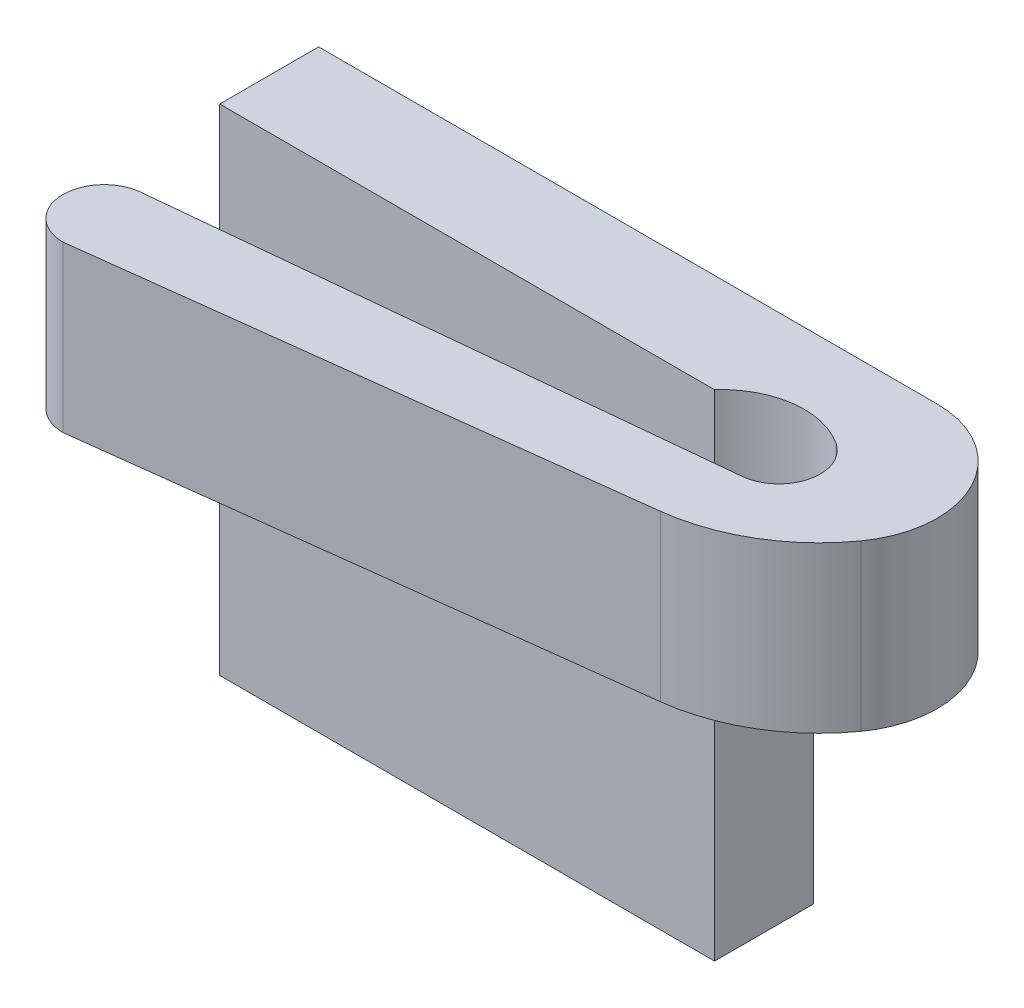
ISO-10303-21;
HEADER;
FILE_DESCRIPTION(('STEP AP214'),'2;1');
FILE_NAME('part.step','',(''),(''),'','','');
FILE_SCHEMA(('AUTOMOTIVE_DESIGN { 1 0 10303 214 1 1 1 1 }'));
ENDSEC;
DATA;
#1=APPLICATION_CONTEXT('core data for automotive mechanical design processes');
#2=APPLICATION_PROTOCOL_DEFINITION('international standard','automotive_design',2000,#1);
#3=PRODUCT_CONTEXT('',#1,'mechanical');
#4=PRODUCT('Part','Part','',(#3));
#5=PRODUCT_RELATED_PRODUCT_CATEGORY('part','',(#4));
#6=PRODUCT_DEFINITION_FORMATION('','',#4);
#7=PRODUCT_DEFINITION_CONTEXT('part definition',#1,'design');
#8=PRODUCT_DEFINITION('design','',#6,#7);
#9=PRODUCT_DEFINITION_SHAPE('','',#8);
#10=(LENGTH_UNIT() NAMED_UNIT(*) SI_UNIT(.MILLI.,.METRE.));
#11=(NAMED_UNIT(*) PLANE_ANGLE_UNIT() SI_UNIT($,.RADIAN.));
#12=(NAMED_UNIT(*) SI_UNIT($,.STERADIAN.) SOLID_ANGLE_UNIT());
#13=UNCERTAINTY_MEASURE_WITH_UNIT(LENGTH_MEASURE(1.E-05),#10,'distance_accuracy_value','');
#14=(GEOMETRIC_REPRESENTATION_CONTEXT(3) GLOBAL_UNCERTAINTY_ASSIGNED_CONTEXT((#13)) GLOBAL_UNIT_ASSIGNED_CONTEXT((#10,
#11,#12)) REPRESENTATION_CONTEXT('',''));
#15=CARTESIAN_POINT('',(0.,0.,0.));
#16=DIRECTION('',(0.,0.,1.));
#17=DIRECTION('',(1.,0.,0.));
#18=AXIS2_PLACEMENT_3D('',#15,#16,#17);
#19=CARTESIAN_POINT('',(6.75,0.,0.661437827766148));
#20=DIRECTION('',(0.,-1.,0.));
#21=DIRECTION('',(0.,0.,-1.));
#22=AXIS2_PLACEMENT_3D('',#19,#20,#21);
#23=PLANE('',#22);
#24=CARTESIAN_POINT('',(6.75,0.,0.661437827766148));
#25=DIRECTION('',(0.,-1.,0.));
#26=DIRECTION('',(0.,0.,-1.));
#27=AXIS2_PLACEMENT_3D('',#24,#25,#26);
#28=CIRCLE('',#27,1.);
#29=CARTESIAN_POINT('',(6.,0.,0.));
#30=VERTEX_POINT('',#29);
#31=CARTESIAN_POINT('',(7.30302361419959,0.,-0.171727751298196));
#32=VERTEX_POINT('',#31);
#33=EDGE_CURVE('E131',#30,#32,#28,.T.);
#34=ORIENTED_EDGE('',*,*,#33,.F.);
#35=DIRECTION('',(0.,0.,-1.));
#36=VECTOR('',#35,1.);
#37=CARTESIAN_POINT('',(6.,0.,0.));
#38=LINE('',#37,#36);
#39=CARTESIAN_POINT('',(6.,0.,-1.2));
#40=VERTEX_POINT('',#39);
#41=EDGE_CURVE('E127',#30,#40,#38,.T.);
#42=ORIENTED_EDGE('',*,*,#41,.T.);
#43=DIRECTION('',(-1.,0.,0.));
#44=VECTOR('',#43,1.);
#45=CARTESIAN_POINT('',(0.,0.,-1.2));
#46=LINE('',#45,#44);
#47=CARTESIAN_POINT('',(7.5,0.,-1.2));
#48=VERTEX_POINT('',#47);
#49=EDGE_CURVE('E158',#48,#40,#46,.T.);
#50=ORIENTED_EDGE('',*,*,#49,.F.);
#51=CARTESIAN_POINT('',(7.5,0.,0.));
#52=DIRECTION('',(0.,1.,0.));
#53=DIRECTION('',(0.,0.,-1.));
#54=AXIS2_PLACEMENT_3D('',#51,#52,#53);
#55=CIRCLE('',#54,1.2);
#56=CARTESIAN_POINT('',(8.4746794344809,0.,0.7));
#57=VERTEX_POINT('',#56);
#58=EDGE_CURVE('E184',#57,#48,#55,.T.);
#59=ORIENTED_EDGE('',*,*,#58,.F.);
#60=CARTESIAN_POINT('',(6.68045714652794,0.,-0.588583258387901));
#61=DIRECTION('',(0.,1.,0.));
#62=DIRECTION('',(0.,0.,-1.));
#63=AXIS2_PLACEMENT_3D('',#60,#61,#62);
#64=CIRCLE('',#63,2.20899987152212);
#65=CARTESIAN_POINT('',(6.9510491450663,0.,1.60378085432507));
#66=VERTEX_POINT('',#65);
#67=EDGE_CURVE('E182',#66,#57,#64,.T.);
#68=ORIENTED_EDGE('',*,*,#67,.F.);
#69=DIRECTION('',(0.99246909924097,0.,-0.122495253180758));
#70=VECTOR('',#69,1.);
#71=CARTESIAN_POINT('',(0.5,0.,2.4));
#72=LINE('',#71,#70);
#73=CARTESIAN_POINT('',(0.5,0.,2.4));
#74=VERTEX_POINT('',#73);
#75=EDGE_CURVE('E180',#74,#66,#72,.T.);
#76=ORIENTED_EDGE('',*,*,#75,.F.);
#77=CARTESIAN_POINT('',(0.5,0.,1.9));
#78=DIRECTION('',(0.,1.,0.));
#79=DIRECTION('',(0.,0.,1.));
#80=AXIS2_PLACEMENT_3D('',#77,#78,#79);
#81=CIRCLE('',#80,0.5);
#82=CARTESIAN_POINT('',(0.500000000000001,0.,1.4));
#83=VERTEX_POINT('',#82);
#84=EDGE_CURVE('E178',#83,#74,#81,.T.);
#85=ORIENTED_EDGE('',*,*,#84,.F.);
#86=DIRECTION('',(-0.995037190209989,0.,0.0995037190209989));
#87=VECTOR('',#86,1.);
#88=CARTESIAN_POINT('',(0.500000000000001,0.,1.4));
#89=LINE('',#88,#87);
#90=CARTESIAN_POINT('',(7.07626366661029,0.,0.742373633338971));
#91=VERTEX_POINT('',#90);
#92=EDGE_CURVE('E176',#91,#83,#89,.T.);
#93=ORIENTED_EDGE('',*,*,#92,.F.);
#94=CARTESIAN_POINT('',(7.02651180709979,0.,0.244855038233976));
#95=DIRECTION('',(0.,-1.,0.));
#96=DIRECTION('',(0.,0.,-1.));
#97=AXIS2_PLACEMENT_3D('',#94,#95,#96);
#98=CIRCLE('',#97,0.5);
#99=EDGE_CURVE('E43',#91,#32,#98,.F.);
#100=ORIENTED_EDGE('',*,*,#99,.T.);
#101=EDGE_LOOP('',(#34,#42,#50,#59,#68,#76,#85,#93,#100));
#102=FACE_BOUND('',#101,.T.);
#103=ADVANCED_FACE('F35',(#102),#23,.T.);
#104=CARTESIAN_POINT('',(0.,2.,-1.2));
#105=DIRECTION('',(1.,0.,0.));
#106=DIRECTION('',(0.,0.,-1.));
#107=AXIS2_PLACEMENT_3D('',#104,#105,#106);
#108=PLANE('',#107);
#109=DIRECTION('',(0.,-1.,0.));
#110=VECTOR('',#109,1.);
#111=CARTESIAN_POINT('',(0.,2.,-1.2));
#112=LINE('',#111,#110);
#113=CARTESIAN_POINT('',(0.,2.,-1.2));
#114=VERTEX_POINT('',#113);
#115=CARTESIAN_POINT('',(0.,-4.,-1.2));
#116=VERTEX_POINT('',#115);
#117=EDGE_CURVE('E174',#114,#116,#112,.T.);
#118=ORIENTED_EDGE('',*,*,#117,.T.);
#119=DIRECTION('',(0.,0.,-1.));
#120=VECTOR('',#119,1.);
#121=CARTESIAN_POINT('',(0.,-4.,0.));
#122=LINE('',#121,#120);
#123=CARTESIAN_POINT('',(0.,-4.,0.));
#124=VERTEX_POINT('',#123);
#125=EDGE_CURVE('E142',#124,#116,#122,.T.);
#126=ORIENTED_EDGE('',*,*,#125,.F.);
#127=DIRECTION('',(0.,-1.,0.));
#128=VECTOR('',#127,1.);
#129=CARTESIAN_POINT('',(0.,2.,0.));
#130=LINE('',#129,#128);
#131=CARTESIAN_POINT('',(0.,2.,0.));
#132=VERTEX_POINT('',#131);
#133=EDGE_CURVE('E138',#132,#124,#130,.T.);
#134=ORIENTED_EDGE('',*,*,#133,.F.);
#135=DIRECTION('',(0.,0.,1.));
#136=VECTOR('',#135,1.);
#137=CARTESIAN_POINT('',(0.,2.,-1.2));
#138=LINE('',#137,#136);
#139=EDGE_CURVE('E154',#114,#132,#138,.T.);
#140=ORIENTED_EDGE('',*,*,#139,.F.);
#141=EDGE_LOOP('',(#118,#126,#134,#140));
#142=FACE_BOUND('',#141,.T.);
#143=ADVANCED_FACE('F238',(#142),#108,.F.);
#144=CARTESIAN_POINT('',(0.,2.,0.));
#145=DIRECTION('',(0.,0.,-1.));
#146=DIRECTION('',(-1.,0.,0.));
#147=AXIS2_PLACEMENT_3D('',#144,#145,#146);
#148=PLANE('',#147);
#149=ORIENTED_EDGE('',*,*,#133,.T.);
#150=DIRECTION('',(-1.,0.,0.));
#151=VECTOR('',#150,1.);
#152=CARTESIAN_POINT('',(0.,-4.,0.));
#153=LINE('',#152,#151);
#154=CARTESIAN_POINT('',(6.,-4.,0.));
#155=VERTEX_POINT('',#154);
#156=EDGE_CURVE('E135',#155,#124,#153,.T.);
#157=ORIENTED_EDGE('',*,*,#156,.F.);
#158=DIRECTION('',(0.,1.,0.));
#159=VECTOR('',#158,1.);
#160=CARTESIAN_POINT('',(6.,-4.,0.));
#161=LINE('',#160,#159);
#162=EDGE_CURVE('E121',#155,#30,#161,.T.);
#163=ORIENTED_EDGE('',*,*,#162,.T.);
#164=DIRECTION('',(0.,-1.,0.));
#165=VECTOR('',#164,1.);
#166=CARTESIAN_POINT('',(6.,2.,0.));
#167=LINE('',#166,#165);
#168=CARTESIAN_POINT('',(6.,2.,0.));
#169=VERTEX_POINT('',#168);
#170=EDGE_CURVE('E204',#169,#30,#167,.T.);
#171=ORIENTED_EDGE('',*,*,#170,.F.);
#172=DIRECTION('',(1.,0.,0.));
#173=VECTOR('',#172,1.);
#174=CARTESIAN_POINT('',(0.,2.,0.));
#175=LINE('',#174,#173);
#176=EDGE_CURVE('E157',#132,#169,#175,.T.);
#177=ORIENTED_EDGE('',*,*,#176,.F.);
#178=EDGE_LOOP('',(#149,#157,#163,#171,#177));
#179=FACE_BOUND('',#178,.T.);
#180=ADVANCED_FACE('F136',(#179),#148,.F.);
#181=CARTESIAN_POINT('',(6.75,2.,0.661437827766148));
#182=DIRECTION('',(0.,-1.,0.));
#183=DIRECTION('',(0.,0.,-1.));
#184=AXIS2_PLACEMENT_3D('',#181,#182,#183);
#185=CYLINDRICAL_SURFACE('',#184,1.);
#186=ORIENTED_EDGE('',*,*,#33,.T.);
#187=DIRECTION('',(0.,-1.,0.));
#188=VECTOR('',#187,1.);
#189=CARTESIAN_POINT('',(7.30302361419959,2.,-0.171727751298196));
#190=LINE('',#189,#188);
#191=CARTESIAN_POINT('',(7.30302361419959,2.,-0.171727751298196));
#192=VERTEX_POINT('',#191);
#193=EDGE_CURVE('E50',#32,#192,#190,.F.);
#194=ORIENTED_EDGE('',*,*,#193,.T.);
#195=CARTESIAN_POINT('',(6.75,2.,0.661437827766148));
#196=DIRECTION('',(0.,-1.,0.));
#197=DIRECTION('',(0.,0.,-1.));
#198=AXIS2_PLACEMENT_3D('',#195,#196,#197);
#199=CIRCLE('',#198,1.);
#200=EDGE_CURVE('E160',#169,#192,#199,.T.);
#201=ORIENTED_EDGE('',*,*,#200,.F.);
#202=ORIENTED_EDGE('',*,*,#170,.T.);
#203=EDGE_LOOP('',(#186,#194,#201,#202));
#204=FACE_BOUND('',#203,.T.);
#205=ADVANCED_FACE('F265',(#204),#185,.F.);
#206=CARTESIAN_POINT('',(0.500000000000001,2.,1.4));
#207=DIRECTION('',(0.0995037190209989,0.,0.995037190209989));
#208=DIRECTION('',(0.995037190209989,0.,-0.0995037190209989));
#209=AXIS2_PLACEMENT_3D('',#206,#207,#208);
#210=PLANE('',#209);
#211=DIRECTION('',(-0.995037190209989,0.,0.0995037190209989));
#212=VECTOR('',#211,1.);
#213=CARTESIAN_POINT('',(0.500000000000001,2.,1.4));
#214=LINE('',#213,#212);
#215=CARTESIAN_POINT('',(7.07626366661029,2.,0.742373633338971));
#216=VERTEX_POINT('',#215);
#217=CARTESIAN_POINT('',(0.500000000000001,2.,1.4));
#218=VERTEX_POINT('',#217);
#219=EDGE_CURVE('E162',#216,#218,#214,.T.);
#220=ORIENTED_EDGE('',*,*,#219,.F.);
#221=DIRECTION('',(0.,1.,0.));
#222=VECTOR('',#221,1.);
#223=CARTESIAN_POINT('',(7.07626366661029,2.,0.74237363333897));
#224=LINE('',#223,#222);
#225=EDGE_CURVE('E207',#216,#91,#224,.F.);
#226=ORIENTED_EDGE('',*,*,#225,.T.);
#227=ORIENTED_EDGE('',*,*,#92,.T.);
#228=DIRECTION('',(0.,-1.,0.));
#229=VECTOR('',#228,1.);
#230=CARTESIAN_POINT('',(0.500000000000001,2.,1.4));
#231=LINE('',#230,#229);
#232=EDGE_CURVE('E201',#218,#83,#231,.T.);
#233=ORIENTED_EDGE('',*,*,#232,.F.);
#234=EDGE_LOOP('',(#220,#226,#227,#233));
#235=FACE_BOUND('',#234,.T.);
#236=ADVANCED_FACE('F213',(#235),#210,.F.);
#237=CARTESIAN_POINT('',(0.5,2.,1.9));
#238=DIRECTION('',(0.,-1.,0.));
#239=DIRECTION('',(0.,0.,-1.));
#240=AXIS2_PLACEMENT_3D('',#237,#238,#239);
#241=CYLINDRICAL_SURFACE('',#240,0.5);
#242=ORIENTED_EDGE('',*,*,#84,.T.);
#243=DIRECTION('',(0.,-1.,0.));
#244=VECTOR('',#243,1.);
#245=CARTESIAN_POINT('',(0.5,2.,2.4));
#246=LINE('',#245,#244);
#247=CARTESIAN_POINT('',(0.5,2.,2.4));
#248=VERTEX_POINT('',#247);
#249=EDGE_CURVE('E198',#248,#74,#246,.T.);
#250=ORIENTED_EDGE('',*,*,#249,.F.);
#251=CARTESIAN_POINT('',(0.5,2.,1.9));
#252=DIRECTION('',(0.,1.,0.));
#253=DIRECTION('',(0.,0.,1.));
#254=AXIS2_PLACEMENT_3D('',#251,#252,#253);
#255=CIRCLE('',#254,0.5);
#256=EDGE_CURVE('E164',#218,#248,#255,.T.);
#257=ORIENTED_EDGE('',*,*,#256,.F.);
#258=ORIENTED_EDGE('',*,*,#232,.T.);
#259=EDGE_LOOP('',(#242,#250,#257,#258));
#260=FACE_BOUND('',#259,.T.);
#261=ADVANCED_FACE('F222',(#260),#241,.T.);
#262=CARTESIAN_POINT('',(0.5,2.,2.4));
#263=DIRECTION('',(-0.122495253180758,0.,-0.99246909924097));
#264=DIRECTION('',(-0.99246909924097,0.,0.122495253180758));
#265=AXIS2_PLACEMENT_3D('',#262,#263,#264);
#266=PLANE('',#265);
#267=ORIENTED_EDGE('',*,*,#75,.T.);
#268=DIRECTION('',(0.,-1.,0.));
#269=VECTOR('',#268,1.);
#270=CARTESIAN_POINT('',(6.9510491450663,2.,1.60378085432507));
#271=LINE('',#270,#269);
#272=CARTESIAN_POINT('',(6.9510491450663,2.,1.60378085432507));
#273=VERTEX_POINT('',#272);
#274=EDGE_CURVE('E195',#273,#66,#271,.T.);
#275=ORIENTED_EDGE('',*,*,#274,.F.);
#276=DIRECTION('',(0.99246909924097,0.,-0.122495253180758));
#277=VECTOR('',#276,1.);
#278=CARTESIAN_POINT('',(0.5,2.,2.4));
#279=LINE('',#278,#277);
#280=EDGE_CURVE('E166',#248,#273,#279,.T.);
#281=ORIENTED_EDGE('',*,*,#280,.F.);
#282=ORIENTED_EDGE('',*,*,#249,.T.);
#283=EDGE_LOOP('',(#267,#275,#281,#282));
#284=FACE_BOUND('',#283,.T.);
#285=ADVANCED_FACE('F226',(#284),#266,.F.);
#286=CARTESIAN_POINT('',(6.68045714652794,2.,-0.588583258387901));
#287=DIRECTION('',(0.,-1.,0.));
#288=DIRECTION('',(0.,0.,-1.));
#289=AXIS2_PLACEMENT_3D('',#286,#287,#288);
#290=CYLINDRICAL_SURFACE('',#289,2.20899987152212);
#291=ORIENTED_EDGE('',*,*,#67,.T.);
#292=DIRECTION('',(0.,-1.,0.));
#293=VECTOR('',#292,1.);
#294=CARTESIAN_POINT('',(8.4746794344809,2.,0.7));
#295=LINE('',#294,#293);
#296=CARTESIAN_POINT('',(8.4746794344809,2.,0.7));
#297=VERTEX_POINT('',#296);
#298=EDGE_CURVE('E192',#297,#57,#295,.T.);
#299=ORIENTED_EDGE('',*,*,#298,.F.);
#300=CARTESIAN_POINT('',(6.68045714652794,2.,-0.588583258387901));
#301=DIRECTION('',(0.,1.,0.));
#302=DIRECTION('',(0.,0.,-1.));
#303=AXIS2_PLACEMENT_3D('',#300,#301,#302);
#304=CIRCLE('',#303,2.20899987152212);
#305=EDGE_CURVE('E168',#273,#297,#304,.T.);
#306=ORIENTED_EDGE('',*,*,#305,.F.);
#307=ORIENTED_EDGE('',*,*,#274,.T.);
#308=EDGE_LOOP('',(#291,#299,#306,#307));
#309=FACE_BOUND('',#308,.T.);
#310=ADVANCED_FACE('F254',(#309),#290,.T.);
#311=CARTESIAN_POINT('',(7.5,2.,0.));
#312=DIRECTION('',(0.,-1.,0.));
#313=DIRECTION('',(0.,0.,-1.));
#314=AXIS2_PLACEMENT_3D('',#311,#312,#313);
#315=CYLINDRICAL_SURFACE('',#314,1.2);
#316=ORIENTED_EDGE('',*,*,#58,.T.);
#317=DIRECTION('',(0.,-1.,0.));
#318=VECTOR('',#317,1.);
#319=CARTESIAN_POINT('',(7.5,2.,-1.2));
#320=LINE('',#319,#318);
#321=CARTESIAN_POINT('',(7.5,2.,-1.2));
#322=VERTEX_POINT('',#321);
#323=EDGE_CURVE('E189',#322,#48,#320,.T.);
#324=ORIENTED_EDGE('',*,*,#323,.F.);
#325=CARTESIAN_POINT('',(7.5,2.,0.));
#326=DIRECTION('',(0.,1.,0.));
#327=DIRECTION('',(0.,0.,-1.));
#328=AXIS2_PLACEMENT_3D('',#325,#326,#327);
#329=CIRCLE('',#328,1.2);
#330=EDGE_CURVE('E170',#297,#322,#329,.T.);
#331=ORIENTED_EDGE('',*,*,#330,.F.);
#332=ORIENTED_EDGE('',*,*,#298,.T.);
#333=EDGE_LOOP('',(#316,#324,#331,#332));
#334=FACE_BOUND('',#333,.T.);
#335=ADVANCED_FACE('F250',(#334),#315,.T.);
#336=CARTESIAN_POINT('',(0.,2.,-1.2));
#337=DIRECTION('',(0.,0.,1.));
#338=DIRECTION('',(1.,0.,0.));
#339=AXIS2_PLACEMENT_3D('',#336,#337,#338);
#340=PLANE('',#339);
#341=ORIENTED_EDGE('',*,*,#49,.T.);
#342=DIRECTION('',(0.,1.,0.));
#343=VECTOR('',#342,1.);
#344=CARTESIAN_POINT('',(6.,-4.,-1.2));
#345=LINE('',#344,#343);
#346=CARTESIAN_POINT('',(6.,-4.,-1.2));
#347=VERTEX_POINT('',#346);
#348=EDGE_CURVE('E132',#347,#40,#345,.T.);
#349=ORIENTED_EDGE('',*,*,#348,.F.);
#350=DIRECTION('',(1.,0.,0.));
#351=VECTOR('',#350,1.);
#352=CARTESIAN_POINT('',(0.,-4.,-1.2));
#353=LINE('',#352,#351);
#354=EDGE_CURVE('E146',#116,#347,#353,.T.);
#355=ORIENTED_EDGE('',*,*,#354,.F.);
#356=ORIENTED_EDGE('',*,*,#117,.F.);
#357=DIRECTION('',(-1.,0.,0.));
#358=VECTOR('',#357,1.);
#359=CARTESIAN_POINT('',(0.,2.,-1.2));
#360=LINE('',#359,#358);
#361=EDGE_CURVE('E172',#322,#114,#360,.T.);
#362=ORIENTED_EDGE('',*,*,#361,.F.);
#363=ORIENTED_EDGE('',*,*,#323,.T.);
#364=EDGE_LOOP('',(#341,#349,#355,#356,#362,#363));
#365=FACE_BOUND('',#364,.T.);
#366=ADVANCED_FACE('F247',(#365),#340,.F.);
#367=CARTESIAN_POINT('',(6.75,2.,0.661437827766148));
#368=DIRECTION('',(0.,-1.,0.));
#369=DIRECTION('',(0.,0.,-1.));
#370=AXIS2_PLACEMENT_3D('',#367,#368,#369);
#371=PLANE('',#370);
#372=ORIENTED_EDGE('',*,*,#139,.T.);
#373=ORIENTED_EDGE('',*,*,#176,.T.);
#374=ORIENTED_EDGE('',*,*,#200,.T.);
#375=CARTESIAN_POINT('',(7.02651180709979,2.,0.244855038233976));
#376=DIRECTION('',(0.,-1.,0.));
#377=DIRECTION('',(0.,0.,-1.));
#378=AXIS2_PLACEMENT_3D('',#375,#376,#377);
#379=CIRCLE('',#378,0.5);
#380=EDGE_CURVE('E11',#192,#216,#379,.T.);
#381=ORIENTED_EDGE('',*,*,#380,.T.);
#382=ORIENTED_EDGE('',*,*,#219,.T.);
#383=ORIENTED_EDGE('',*,*,#256,.T.);
#384=ORIENTED_EDGE('',*,*,#280,.T.);
#385=ORIENTED_EDGE('',*,*,#305,.T.);
#386=ORIENTED_EDGE('',*,*,#330,.T.);
#387=ORIENTED_EDGE('',*,*,#361,.T.);
#388=EDGE_LOOP('',(#372,#373,#374,#381,#382,#383,#384,#385,#386,#387));
#389=FACE_BOUND('',#388,.T.);
#390=ADVANCED_FACE('F230',(#389),#371,.F.);
#391=CARTESIAN_POINT('',(6.,-4.,0.));
#392=DIRECTION('',(1.,0.,0.));
#393=DIRECTION('',(0.,0.,-1.));
#394=AXIS2_PLACEMENT_3D('',#391,#392,#393);
#395=PLANE('',#394);
#396=ORIENTED_EDGE('',*,*,#41,.F.);
#397=ORIENTED_EDGE('',*,*,#162,.F.);
#398=DIRECTION('',(0.,0.,-1.));
#399=VECTOR('',#398,1.);
#400=CARTESIAN_POINT('',(6.,-4.,0.));
#401=LINE('',#400,#399);
#402=EDGE_CURVE('E125',#155,#347,#401,.T.);
#403=ORIENTED_EDGE('',*,*,#402,.T.);
#404=ORIENTED_EDGE('',*,*,#348,.T.);
#405=EDGE_LOOP('',(#396,#397,#403,#404));
#406=FACE_BOUND('',#405,.T.);
#407=ADVANCED_FACE('F123',(#406),#395,.T.);
#408=CARTESIAN_POINT('',(0.,-4.,0.));
#409=DIRECTION('',(0.,-1.,0.));
#410=DIRECTION('',(0.,0.,-1.));
#411=AXIS2_PLACEMENT_3D('',#408,#409,#410);
#412=PLANE('',#411);
#413=ORIENTED_EDGE('',*,*,#402,.F.);
#414=ORIENTED_EDGE('',*,*,#156,.T.);
#415=ORIENTED_EDGE('',*,*,#125,.T.);
#416=ORIENTED_EDGE('',*,*,#354,.T.);
#417=EDGE_LOOP('',(#413,#414,#415,#416));
#418=FACE_BOUND('',#417,.T.);
#419=ADVANCED_FACE('F144',(#418),#412,.T.);
#420=CARTESIAN_POINT('',(7.02651180709979,2.,0.244855038233976));
#421=DIRECTION('',(0.,-1.,0.));
#422=DIRECTION('',(0.,0.,-1.));
#423=AXIS2_PLACEMENT_3D('',#420,#421,#422);
#424=CYLINDRICAL_SURFACE('',#423,0.5);
#425=ORIENTED_EDGE('',*,*,#380,.F.);
#426=ORIENTED_EDGE('',*,*,#193,.F.);
#427=ORIENTED_EDGE('',*,*,#99,.F.);
#428=ORIENTED_EDGE('',*,*,#225,.F.);
#429=EDGE_LOOP('',(#425,#426,#427,#428));
#430=FACE_BOUND('',#429,.T.);
#431=ADVANCED_FACE('F37',(#430),#424,.F.);
#432=CLOSED_SHELL('',(#103,#143,#180,#205,#236,#261,#285,#310,#335,#366,#390,#407,#419,#431));
#433=MANIFOLD_SOLID_BREP('B2',#432);
#434=ADVANCED_BREP_SHAPE_REPRESENTATION('',(#18,#433),#14);
#435=SHAPE_DEFINITION_REPRESENTATION(#9,#434);
ENDSEC;
END-ISO-10303-21;
